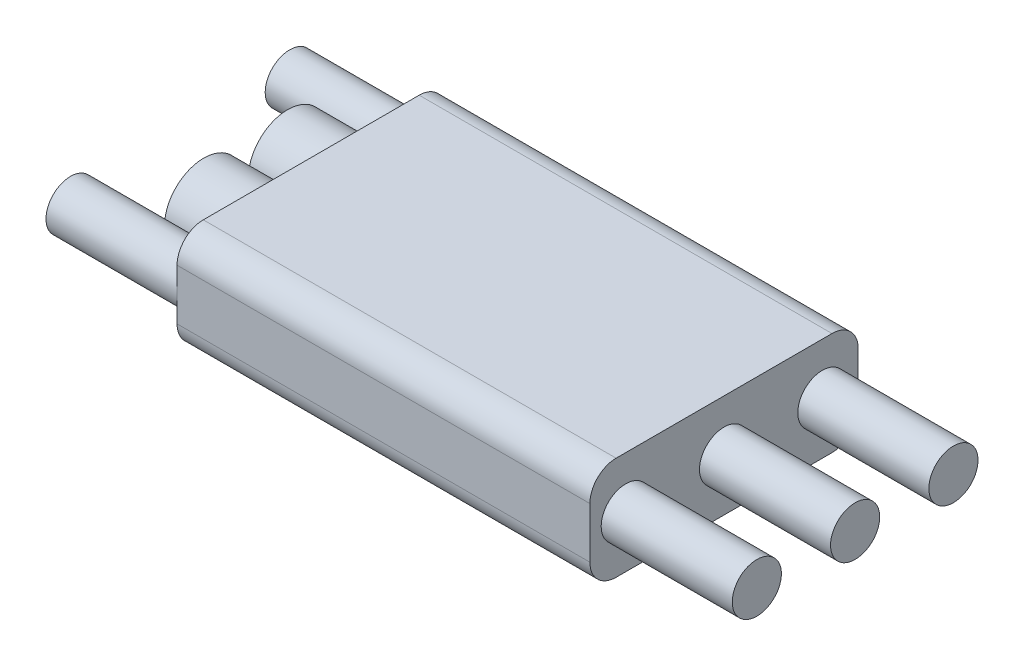
ISO-10303-21;
HEADER;
FILE_DESCRIPTION(('STEP AP214'),'2;1');
FILE_NAME('part.step','',(''),(''),'','','');
FILE_SCHEMA(('AUTOMOTIVE_DESIGN { 1 0 10303 214 1 1 1 1 }'));
ENDSEC;
DATA;
#1=APPLICATION_CONTEXT('core data for automotive mechanical design processes');
#2=APPLICATION_PROTOCOL_DEFINITION('international standard','automotive_design',2000,#1);
#3=PRODUCT_CONTEXT('',#1,'mechanical');
#4=PRODUCT('Part','Part','',(#3));
#5=PRODUCT_RELATED_PRODUCT_CATEGORY('part','',(#4));
#6=PRODUCT_DEFINITION_FORMATION('','',#4);
#7=PRODUCT_DEFINITION_CONTEXT('part definition',#1,'design');
#8=PRODUCT_DEFINITION('design','',#6,#7);
#9=PRODUCT_DEFINITION_SHAPE('','',#8);
#10=(LENGTH_UNIT() NAMED_UNIT(*) SI_UNIT(.MILLI.,.METRE.));
#11=(NAMED_UNIT(*) PLANE_ANGLE_UNIT() SI_UNIT($,.RADIAN.));
#12=(NAMED_UNIT(*) SI_UNIT($,.STERADIAN.) SOLID_ANGLE_UNIT());
#13=UNCERTAINTY_MEASURE_WITH_UNIT(LENGTH_MEASURE(1.E-05),#10,'distance_accuracy_value','');
#14=(GEOMETRIC_REPRESENTATION_CONTEXT(3) GLOBAL_UNCERTAINTY_ASSIGNED_CONTEXT((#13)) GLOBAL_UNIT_ASSIGNED_CONTEXT((#10,
#11,#12)) REPRESENTATION_CONTEXT('',''));
#15=CARTESIAN_POINT('',(0.,0.,0.));
#16=DIRECTION('',(0.,0.,1.));
#17=DIRECTION('',(1.,0.,0.));
#18=AXIS2_PLACEMENT_3D('',#15,#16,#17);
#19=CARTESIAN_POINT('',(20.,5.,13.));
#20=DIRECTION('',(-1.,0.,0.));
#21=DIRECTION('',(0.,0.,1.));
#22=AXIS2_PLACEMENT_3D('',#19,#20,#21);
#23=PLANE('',#22);
#24=CARTESIAN_POINT('',(20.,0.,-9.525));
#25=DIRECTION('',(-1.,0.,0.));
#26=DIRECTION('',(0.,0.,1.));
#27=AXIS2_PLACEMENT_3D('',#24,#25,#26);
#28=CIRCLE('',#27,2.38125);
#29=CARTESIAN_POINT('',(20.,0.,-7.14375));
#30=VERTEX_POINT('',#29);
#31=EDGE_CURVE('E141',#30,#30,#28,.F.);
#32=ORIENTED_EDGE('',*,*,#31,.F.);
#33=EDGE_LOOP('',(#32));
#34=FACE_BOUND('',#33,.T.);
#35=CARTESIAN_POINT('',(20.,0.,9.525));
#36=DIRECTION('',(-1.,0.,0.));
#37=DIRECTION('',(0.,0.,1.));
#38=AXIS2_PLACEMENT_3D('',#35,#36,#37);
#39=CIRCLE('',#38,2.38125);
#40=CARTESIAN_POINT('',(20.,0.,11.90625));
#41=VERTEX_POINT('',#40);
#42=EDGE_CURVE('E138',#41,#41,#39,.F.);
#43=ORIENTED_EDGE('',*,*,#42,.F.);
#44=EDGE_LOOP('',(#43));
#45=FACE_BOUND('',#44,.T.);
#46=CARTESIAN_POINT('',(20.,0.,0.));
#47=DIRECTION('',(-1.,0.,0.));
#48=DIRECTION('',(0.,0.,1.));
#49=AXIS2_PLACEMENT_3D('',#46,#47,#48);
#50=CIRCLE('',#49,2.38125);
#51=CARTESIAN_POINT('',(20.,0.,2.38125));
#52=VERTEX_POINT('',#51);
#53=EDGE_CURVE('E135',#52,#52,#50,.F.);
#54=ORIENTED_EDGE('',*,*,#53,.F.);
#55=EDGE_LOOP('',(#54));
#56=FACE_BOUND('',#55,.T.);
#57=DIRECTION('',(0.,-1.,0.));
#58=VECTOR('',#57,1.);
#59=CARTESIAN_POINT('',(20.,5.,13.));
#60=LINE('',#59,#58);
#61=CARTESIAN_POINT('',(20.,2.46,13.));
#62=VERTEX_POINT('',#61);
#63=CARTESIAN_POINT('',(20.,-2.46,13.));
#64=VERTEX_POINT('',#63);
#65=EDGE_CURVE('E124',#62,#64,#60,.T.);
#66=ORIENTED_EDGE('',*,*,#65,.T.);
#67=CARTESIAN_POINT('',(20.,-2.46,10.46));
#68=DIRECTION('',(-1.,0.,0.));
#69=DIRECTION('',(0.,0.,1.));
#70=AXIS2_PLACEMENT_3D('',#67,#68,#69);
#71=CIRCLE('',#70,2.54);
#72=CARTESIAN_POINT('',(20.,-5.,10.46));
#73=VERTEX_POINT('',#72);
#74=EDGE_CURVE('E159',#64,#73,#71,.F.);
#75=ORIENTED_EDGE('',*,*,#74,.T.);
#76=DIRECTION('',(0.,0.,-1.));
#77=VECTOR('',#76,1.);
#78=CARTESIAN_POINT('',(20.,-5.,13.));
#79=LINE('',#78,#77);
#80=CARTESIAN_POINT('',(20.,-5.,-10.46));
#81=VERTEX_POINT('',#80);
#82=EDGE_CURVE('E189',#73,#81,#79,.T.);
#83=ORIENTED_EDGE('',*,*,#82,.T.);
#84=CARTESIAN_POINT('',(20.,-2.46,-10.46));
#85=DIRECTION('',(-1.,0.,0.));
#86=DIRECTION('',(0.,0.,1.));
#87=AXIS2_PLACEMENT_3D('',#84,#85,#86);
#88=CIRCLE('',#87,2.54);
#89=CARTESIAN_POINT('',(20.,-2.46,-13.));
#90=VERTEX_POINT('',#89);
#91=EDGE_CURVE('E157',#81,#90,#88,.F.);
#92=ORIENTED_EDGE('',*,*,#91,.T.);
#93=DIRECTION('',(0.,-1.,0.));
#94=VECTOR('',#93,1.);
#95=CARTESIAN_POINT('',(20.,5.,-13.));
#96=LINE('',#95,#94);
#97=CARTESIAN_POINT('',(20.,2.46,-13.));
#98=VERTEX_POINT('',#97);
#99=EDGE_CURVE('E132',#98,#90,#96,.T.);
#100=ORIENTED_EDGE('',*,*,#99,.F.);
#101=CARTESIAN_POINT('',(20.,2.46,-10.46));
#102=DIRECTION('',(-1.,0.,0.));
#103=DIRECTION('',(0.,0.,1.));
#104=AXIS2_PLACEMENT_3D('',#101,#102,#103);
#105=CIRCLE('',#104,2.54);
#106=CARTESIAN_POINT('',(20.,5.,-10.46));
#107=VERTEX_POINT('',#106);
#108=EDGE_CURVE('E155',#98,#107,#105,.F.);
#109=ORIENTED_EDGE('',*,*,#108,.T.);
#110=DIRECTION('',(0.,0.,-1.));
#111=VECTOR('',#110,1.);
#112=CARTESIAN_POINT('',(20.,5.,13.));
#113=LINE('',#112,#111);
#114=CARTESIAN_POINT('',(20.,5.,10.46));
#115=VERTEX_POINT('',#114);
#116=EDGE_CURVE('E180',#115,#107,#113,.T.);
#117=ORIENTED_EDGE('',*,*,#116,.F.);
#118=CARTESIAN_POINT('',(20.,2.46,10.46));
#119=DIRECTION('',(-1.,0.,0.));
#120=DIRECTION('',(0.,0.,1.));
#121=AXIS2_PLACEMENT_3D('',#118,#119,#120);
#122=CIRCLE('',#121,2.54);
#123=EDGE_CURVE('E153',#115,#62,#122,.F.);
#124=ORIENTED_EDGE('',*,*,#123,.T.);
#125=EDGE_LOOP('',(#66,#75,#83,#92,#100,#109,#117,#124));
#126=FACE_BOUND('',#125,.T.);
#127=ADVANCED_FACE('F33',(#34,#45,#56,#126),#23,.F.);
#128=CARTESIAN_POINT('',(-20.,5.,-13.));
#129=DIRECTION('',(0.,0.,1.));
#130=DIRECTION('',(1.,0.,0.));
#131=AXIS2_PLACEMENT_3D('',#128,#129,#130);
#132=PLANE('',#131);
#133=ORIENTED_EDGE('',*,*,#99,.T.);
#134=DIRECTION('',(-1.,0.,0.));
#135=VECTOR('',#134,1.);
#136=CARTESIAN_POINT('',(-20.,-2.46,-13.));
#137=LINE('',#136,#135);
#138=CARTESIAN_POINT('',(-20.,-2.46,-13.));
#139=VERTEX_POINT('',#138);
#140=EDGE_CURVE('E172',#90,#139,#137,.T.);
#141=ORIENTED_EDGE('',*,*,#140,.T.);
#142=DIRECTION('',(0.,-1.,0.));
#143=VECTOR('',#142,1.);
#144=CARTESIAN_POINT('',(-20.,5.,-13.));
#145=LINE('',#144,#143);
#146=CARTESIAN_POINT('',(-20.,0.,-13.));
#147=VERTEX_POINT('',#146);
#148=EDGE_CURVE('E116',#147,#139,#145,.T.);
#149=ORIENTED_EDGE('',*,*,#148,.F.);
#150=CARTESIAN_POINT('',(-20.,2.46,-13.));
#151=VERTEX_POINT('',#150);
#152=EDGE_CURVE('E130',#151,#147,#145,.T.);
#153=ORIENTED_EDGE('',*,*,#152,.F.);
#154=DIRECTION('',(-1.,0.,0.));
#155=VECTOR('',#154,1.);
#156=CARTESIAN_POINT('',(-20.,2.46,-13.));
#157=LINE('',#156,#155);
#158=EDGE_CURVE('E170',#151,#98,#157,.F.);
#159=ORIENTED_EDGE('',*,*,#158,.T.);
#160=EDGE_LOOP('',(#133,#141,#149,#153,#159));
#161=FACE_BOUND('',#160,.T.);
#162=ADVANCED_FACE('F242',(#161),#132,.F.);
#163=CARTESIAN_POINT('',(-20.,5.,13.));
#164=DIRECTION('',(1.,0.,0.));
#165=DIRECTION('',(0.,0.,-1.));
#166=AXIS2_PLACEMENT_3D('',#163,#164,#165);
#167=PLANE('',#166);
#168=CARTESIAN_POINT('',(-20.,0.,4.064));
#169=DIRECTION('',(1.,0.,0.));
#170=DIRECTION('',(0.,0.,-1.));
#171=AXIS2_PLACEMENT_3D('',#168,#169,#170);
#172=CIRCLE('',#171,3.81);
#173=CARTESIAN_POINT('',(-20.,0.,0.254000000000001));
#174=VERTEX_POINT('',#173);
#175=EDGE_CURVE('E147',#174,#174,#172,.F.);
#176=ORIENTED_EDGE('',*,*,#175,.F.);
#177=EDGE_LOOP('',(#176));
#178=FACE_BOUND('',#177,.T.);
#179=CARTESIAN_POINT('',(-20.,0.,-4.064));
#180=DIRECTION('',(1.,0.,0.));
#181=DIRECTION('',(0.,0.,-1.));
#182=AXIS2_PLACEMENT_3D('',#179,#180,#181);
#183=CIRCLE('',#182,3.81);
#184=CARTESIAN_POINT('',(-20.,0.,-7.874));
#185=VERTEX_POINT('',#184);
#186=EDGE_CURVE('E144',#185,#185,#183,.F.);
#187=ORIENTED_EDGE('',*,*,#186,.F.);
#188=EDGE_LOOP('',(#187));
#189=FACE_BOUND('',#188,.T.);
#190=DIRECTION('',(0.,0.,1.));
#191=VECTOR('',#190,1.);
#192=CARTESIAN_POINT('',(-20.,-5.,13.));
#193=LINE('',#192,#191);
#194=CARTESIAN_POINT('',(-20.,-5.,-10.46));
#195=VERTEX_POINT('',#194);
#196=CARTESIAN_POINT('',(-20.,-5.,10.46));
#197=VERTEX_POINT('',#196);
#198=EDGE_CURVE('E186',#195,#197,#193,.T.);
#199=ORIENTED_EDGE('',*,*,#198,.T.);
#200=CARTESIAN_POINT('',(-20.,-2.46,10.46));
#201=DIRECTION('',(1.,0.,0.));
#202=DIRECTION('',(0.,0.,-1.));
#203=AXIS2_PLACEMENT_3D('',#200,#201,#202);
#204=CIRCLE('',#203,2.54);
#205=CARTESIAN_POINT('',(-20.,-2.46,13.));
#206=VERTEX_POINT('',#205);
#207=EDGE_CURVE('E123',#197,#206,#204,.F.);
#208=ORIENTED_EDGE('',*,*,#207,.T.);
#209=DIRECTION('',(0.,-1.,0.));
#210=VECTOR('',#209,1.);
#211=CARTESIAN_POINT('',(-20.,5.,13.));
#212=LINE('',#211,#210);
#213=CARTESIAN_POINT('',(-20.,0.,13.));
#214=VERTEX_POINT('',#213);
#215=EDGE_CURVE('E109',#214,#206,#212,.T.);
#216=ORIENTED_EDGE('',*,*,#215,.F.);
#217=CARTESIAN_POINT('',(-20.,0.,10.61875));
#218=DIRECTION('',(-1.,0.,0.));
#219=DIRECTION('',(0.,0.,1.));
#220=AXIS2_PLACEMENT_3D('',#217,#218,#219);
#221=CIRCLE('',#220,2.38125);
#222=EDGE_CURVE('E121',#214,#214,#221,.T.);
#223=ORIENTED_EDGE('',*,*,#222,.F.);
#224=CARTESIAN_POINT('',(-20.,2.46,13.));
#225=VERTEX_POINT('',#224);
#226=EDGE_CURVE('E105',#225,#214,#212,.T.);
#227=ORIENTED_EDGE('',*,*,#226,.F.);
#228=CARTESIAN_POINT('',(-20.,2.46,10.46));
#229=DIRECTION('',(1.,0.,0.));
#230=DIRECTION('',(0.,0.,-1.));
#231=AXIS2_PLACEMENT_3D('',#228,#229,#230);
#232=CIRCLE('',#231,2.54);
#233=CARTESIAN_POINT('',(-20.,5.,10.46));
#234=VERTEX_POINT('',#233);
#235=EDGE_CURVE('E165',#225,#234,#232,.F.);
#236=ORIENTED_EDGE('',*,*,#235,.T.);
#237=DIRECTION('',(0.,0.,1.));
#238=VECTOR('',#237,1.);
#239=CARTESIAN_POINT('',(-20.,5.,13.));
#240=LINE('',#239,#238);
#241=CARTESIAN_POINT('',(-20.,5.,-10.46));
#242=VERTEX_POINT('',#241);
#243=EDGE_CURVE('E126',#242,#234,#240,.T.);
#244=ORIENTED_EDGE('',*,*,#243,.F.);
#245=CARTESIAN_POINT('',(-20.,2.46,-10.46));
#246=DIRECTION('',(1.,0.,0.));
#247=DIRECTION('',(0.,0.,-1.));
#248=AXIS2_PLACEMENT_3D('',#245,#246,#247);
#249=CIRCLE('',#248,2.54);
#250=EDGE_CURVE('E56',#242,#151,#249,.F.);
#251=ORIENTED_EDGE('',*,*,#250,.T.);
#252=ORIENTED_EDGE('',*,*,#152,.T.);
#253=CARTESIAN_POINT('',(-20.,0.,-10.61875));
#254=DIRECTION('',(-1.,0.,0.));
#255=DIRECTION('',(0.,0.,1.));
#256=AXIS2_PLACEMENT_3D('',#253,#254,#255);
#257=CIRCLE('',#256,2.38125);
#258=EDGE_CURVE('E215',#147,#147,#257,.T.);
#259=ORIENTED_EDGE('',*,*,#258,.F.);
#260=ORIENTED_EDGE('',*,*,#148,.T.);
#261=CARTESIAN_POINT('',(-20.,-2.46,-10.46));
#262=DIRECTION('',(1.,0.,0.));
#263=DIRECTION('',(0.,0.,-1.));
#264=AXIS2_PLACEMENT_3D('',#261,#262,#263);
#265=CIRCLE('',#264,2.54);
#266=EDGE_CURVE('E48',#139,#195,#265,.F.);
#267=ORIENTED_EDGE('',*,*,#266,.T.);
#268=EDGE_LOOP('',(#199,#208,#216,#223,#227,#236,#244,#251,#252,#259,#260,#267));
#269=FACE_BOUND('',#268,.T.);
#270=ADVANCED_FACE('F119',(#178,#189,#269),#167,.F.);
#271=CARTESIAN_POINT('',(-20.,5.,13.));
#272=DIRECTION('',(0.,0.,-1.));
#273=DIRECTION('',(-1.,0.,0.));
#274=AXIS2_PLACEMENT_3D('',#271,#272,#273);
#275=PLANE('',#274);
#276=ORIENTED_EDGE('',*,*,#215,.T.);
#277=DIRECTION('',(1.,0.,0.));
#278=VECTOR('',#277,1.);
#279=CARTESIAN_POINT('',(20.,-2.46,13.));
#280=LINE('',#279,#278);
#281=EDGE_CURVE('E151',#206,#64,#280,.T.);
#282=ORIENTED_EDGE('',*,*,#281,.T.);
#283=ORIENTED_EDGE('',*,*,#65,.F.);
#284=DIRECTION('',(1.,0.,0.));
#285=VECTOR('',#284,1.);
#286=CARTESIAN_POINT('',(-20.,2.46,13.));
#287=LINE('',#286,#285);
#288=EDGE_CURVE('E113',#62,#225,#287,.F.);
#289=ORIENTED_EDGE('',*,*,#288,.T.);
#290=ORIENTED_EDGE('',*,*,#226,.T.);
#291=EDGE_LOOP('',(#276,#282,#283,#289,#290));
#292=FACE_BOUND('',#291,.T.);
#293=ADVANCED_FACE('F107',(#292),#275,.F.);
#294=CARTESIAN_POINT('',(0.,5.,0.));
#295=DIRECTION('',(0.,-1.,0.));
#296=DIRECTION('',(0.,0.,-1.));
#297=AXIS2_PLACEMENT_3D('',#294,#295,#296);
#298=PLANE('',#297);
#299=ORIENTED_EDGE('',*,*,#116,.T.);
#300=DIRECTION('',(-1.,0.,0.));
#301=VECTOR('',#300,1.);
#302=CARTESIAN_POINT('',(0.,5.,-10.46));
#303=LINE('',#302,#301);
#304=EDGE_CURVE('E11',#107,#242,#303,.T.);
#305=ORIENTED_EDGE('',*,*,#304,.T.);
#306=ORIENTED_EDGE('',*,*,#243,.T.);
#307=DIRECTION('',(1.,0.,0.));
#308=VECTOR('',#307,1.);
#309=CARTESIAN_POINT('',(0.,5.,10.46));
#310=LINE('',#309,#308);
#311=EDGE_CURVE('E41',#234,#115,#310,.T.);
#312=ORIENTED_EDGE('',*,*,#311,.T.);
#313=EDGE_LOOP('',(#299,#305,#306,#312));
#314=FACE_BOUND('',#313,.T.);
#315=ADVANCED_FACE('F179',(#314),#298,.F.);
#316=CARTESIAN_POINT('',(0.,-5.,0.));
#317=DIRECTION('',(0.,-1.,0.));
#318=DIRECTION('',(0.,0.,-1.));
#319=AXIS2_PLACEMENT_3D('',#316,#317,#318);
#320=PLANE('',#319);
#321=ORIENTED_EDGE('',*,*,#82,.F.);
#322=DIRECTION('',(1.,0.,0.));
#323=VECTOR('',#322,1.);
#324=CARTESIAN_POINT('',(-20.,-5.,10.46));
#325=LINE('',#324,#323);
#326=EDGE_CURVE('E163',#73,#197,#325,.F.);
#327=ORIENTED_EDGE('',*,*,#326,.T.);
#328=ORIENTED_EDGE('',*,*,#198,.F.);
#329=DIRECTION('',(-1.,0.,0.));
#330=VECTOR('',#329,1.);
#331=CARTESIAN_POINT('',(20.,-5.,-10.46));
#332=LINE('',#331,#330);
#333=EDGE_CURVE('E161',#195,#81,#332,.F.);
#334=ORIENTED_EDGE('',*,*,#333,.T.);
#335=EDGE_LOOP('',(#321,#327,#328,#334));
#336=FACE_BOUND('',#335,.T.);
#337=ADVANCED_FACE('F315',(#336),#320,.T.);
#338=CARTESIAN_POINT('',(32.7,0.,0.));
#339=DIRECTION('',(-1.,0.,0.));
#340=DIRECTION('',(0.,0.,1.));
#341=AXIS2_PLACEMENT_3D('',#338,#339,#340);
#342=CYLINDRICAL_SURFACE('',#341,2.38125);
#343=CARTESIAN_POINT('',(32.7,0.,0.));
#344=DIRECTION('',(1.,0.,0.));
#345=DIRECTION('',(0.,0.,-1.));
#346=AXIS2_PLACEMENT_3D('',#343,#344,#345);
#347=CIRCLE('',#346,2.38125);
#348=CARTESIAN_POINT('',(32.7,0.,-2.38125));
#349=VERTEX_POINT('',#348);
#350=EDGE_CURVE('E191',#349,#349,#347,.T.);
#351=ORIENTED_EDGE('',*,*,#350,.F.);
#352=EDGE_LOOP('',(#351));
#353=FACE_BOUND('',#352,.T.);
#354=ORIENTED_EDGE('',*,*,#53,.T.);
#355=EDGE_LOOP('',(#354));
#356=FACE_BOUND('',#355,.T.);
#357=ADVANCED_FACE('F312',(#353,#356),#342,.T.);
#358=CARTESIAN_POINT('',(32.7,0.,0.));
#359=DIRECTION('',(1.,0.,0.));
#360=DIRECTION('',(0.,0.,-1.));
#361=AXIS2_PLACEMENT_3D('',#358,#359,#360);
#362=PLANE('',#361);
#363=ORIENTED_EDGE('',*,*,#350,.T.);
#364=EDGE_LOOP('',(#363));
#365=FACE_BOUND('',#364,.T.);
#366=ADVANCED_FACE('F308',(#365),#362,.T.);
#367=CARTESIAN_POINT('',(32.7,0.,9.525));
#368=DIRECTION('',(-1.,0.,0.));
#369=DIRECTION('',(0.,0.,1.));
#370=AXIS2_PLACEMENT_3D('',#367,#368,#369);
#371=CYLINDRICAL_SURFACE('',#370,2.38125);
#372=CARTESIAN_POINT('',(32.7,0.,9.525));
#373=DIRECTION('',(1.,0.,0.));
#374=DIRECTION('',(0.,0.,-1.));
#375=AXIS2_PLACEMENT_3D('',#372,#373,#374);
#376=CIRCLE('',#375,2.38125);
#377=CARTESIAN_POINT('',(32.7,0.,7.14375));
#378=VERTEX_POINT('',#377);
#379=EDGE_CURVE('E198',#378,#378,#376,.T.);
#380=ORIENTED_EDGE('',*,*,#379,.F.);
#381=EDGE_LOOP('',(#380));
#382=FACE_BOUND('',#381,.T.);
#383=ORIENTED_EDGE('',*,*,#42,.T.);
#384=EDGE_LOOP('',(#383));
#385=FACE_BOUND('',#384,.T.);
#386=ADVANCED_FACE('F305',(#382,#385),#371,.T.);
#387=CARTESIAN_POINT('',(32.7,0.,9.525));
#388=DIRECTION('',(1.,0.,0.));
#389=DIRECTION('',(0.,0.,-1.));
#390=AXIS2_PLACEMENT_3D('',#387,#388,#389);
#391=PLANE('',#390);
#392=ORIENTED_EDGE('',*,*,#379,.T.);
#393=EDGE_LOOP('',(#392));
#394=FACE_BOUND('',#393,.T.);
#395=ADVANCED_FACE('F301',(#394),#391,.T.);
#396=CARTESIAN_POINT('',(32.7,0.,-9.525));
#397=DIRECTION('',(-1.,0.,0.));
#398=DIRECTION('',(0.,0.,1.));
#399=AXIS2_PLACEMENT_3D('',#396,#397,#398);
#400=CYLINDRICAL_SURFACE('',#399,2.38125);
#401=CARTESIAN_POINT('',(32.7,0.,-9.525));
#402=DIRECTION('',(1.,0.,0.));
#403=DIRECTION('',(0.,0.,-1.));
#404=AXIS2_PLACEMENT_3D('',#401,#402,#403);
#405=CIRCLE('',#404,2.38125);
#406=CARTESIAN_POINT('',(32.7,0.,-11.90625));
#407=VERTEX_POINT('',#406);
#408=EDGE_CURVE('E202',#407,#407,#405,.T.);
#409=ORIENTED_EDGE('',*,*,#408,.F.);
#410=EDGE_LOOP('',(#409));
#411=FACE_BOUND('',#410,.T.);
#412=ORIENTED_EDGE('',*,*,#31,.T.);
#413=EDGE_LOOP('',(#412));
#414=FACE_BOUND('',#413,.T.);
#415=ADVANCED_FACE('F297',(#411,#414),#400,.T.);
#416=CARTESIAN_POINT('',(32.7,0.,-9.525));
#417=DIRECTION('',(1.,0.,0.));
#418=DIRECTION('',(0.,0.,-1.));
#419=AXIS2_PLACEMENT_3D('',#416,#417,#418);
#420=PLANE('',#419);
#421=ORIENTED_EDGE('',*,*,#408,.T.);
#422=EDGE_LOOP('',(#421));
#423=FACE_BOUND('',#422,.T.);
#424=ADVANCED_FACE('F293',(#423),#420,.T.);
#425=CARTESIAN_POINT('',(-26.35,0.,-4.064));
#426=DIRECTION('',(1.,0.,0.));
#427=DIRECTION('',(0.,0.,-1.));
#428=AXIS2_PLACEMENT_3D('',#425,#426,#427);
#429=CYLINDRICAL_SURFACE('',#428,3.81);
#430=CARTESIAN_POINT('',(-26.35,0.,-4.064));
#431=DIRECTION('',(-1.,0.,0.));
#432=DIRECTION('',(0.,0.,1.));
#433=AXIS2_PLACEMENT_3D('',#430,#431,#432);
#434=CIRCLE('',#433,3.81);
#435=CARTESIAN_POINT('',(-26.35,0.,-0.254));
#436=VERTEX_POINT('',#435);
#437=EDGE_CURVE('E206',#436,#436,#434,.T.);
#438=ORIENTED_EDGE('',*,*,#437,.F.);
#439=EDGE_LOOP('',(#438));
#440=FACE_BOUND('',#439,.T.);
#441=ORIENTED_EDGE('',*,*,#186,.T.);
#442=EDGE_LOOP('',(#441));
#443=FACE_BOUND('',#442,.T.);
#444=ADVANCED_FACE('F289',(#440,#443),#429,.T.);
#445=CARTESIAN_POINT('',(-26.35,0.,-4.064));
#446=DIRECTION('',(-1.,0.,0.));
#447=DIRECTION('',(0.,0.,1.));
#448=AXIS2_PLACEMENT_3D('',#445,#446,#447);
#449=PLANE('',#448);
#450=ORIENTED_EDGE('',*,*,#437,.T.);
#451=EDGE_LOOP('',(#450));
#452=FACE_BOUND('',#451,.T.);
#453=ADVANCED_FACE('F285',(#452),#449,.T.);
#454=CARTESIAN_POINT('',(-26.35,0.,4.064));
#455=DIRECTION('',(1.,0.,0.));
#456=DIRECTION('',(0.,0.,-1.));
#457=AXIS2_PLACEMENT_3D('',#454,#455,#456);
#458=CYLINDRICAL_SURFACE('',#457,3.81);
#459=CARTESIAN_POINT('',(-26.35,0.,4.064));
#460=DIRECTION('',(-1.,0.,0.));
#461=DIRECTION('',(0.,0.,1.));
#462=AXIS2_PLACEMENT_3D('',#459,#460,#461);
#463=CIRCLE('',#462,3.81);
#464=CARTESIAN_POINT('',(-26.35,0.,7.874));
#465=VERTEX_POINT('',#464);
#466=EDGE_CURVE('E211',#465,#465,#463,.T.);
#467=ORIENTED_EDGE('',*,*,#466,.F.);
#468=EDGE_LOOP('',(#467));
#469=FACE_BOUND('',#468,.T.);
#470=ORIENTED_EDGE('',*,*,#175,.T.);
#471=EDGE_LOOP('',(#470));
#472=FACE_BOUND('',#471,.T.);
#473=ADVANCED_FACE('F278',(#469,#472),#458,.T.);
#474=CARTESIAN_POINT('',(-26.35,0.,4.064));
#475=DIRECTION('',(-1.,0.,0.));
#476=DIRECTION('',(0.,0.,1.));
#477=AXIS2_PLACEMENT_3D('',#474,#475,#476);
#478=PLANE('',#477);
#479=ORIENTED_EDGE('',*,*,#466,.T.);
#480=EDGE_LOOP('',(#479));
#481=FACE_BOUND('',#480,.T.);
#482=ADVANCED_FACE('F272',(#481),#478,.T.);
#483=CARTESIAN_POINT('',(-32.7,0.,-10.61875));
#484=DIRECTION('',(1.,0.,0.));
#485=DIRECTION('',(0.,0.,-1.));
#486=AXIS2_PLACEMENT_3D('',#483,#484,#485);
#487=CYLINDRICAL_SURFACE('',#486,2.38125);
#488=CARTESIAN_POINT('',(-32.7,0.,-10.61875));
#489=DIRECTION('',(-1.,0.,0.));
#490=DIRECTION('',(0.,0.,1.));
#491=AXIS2_PLACEMENT_3D('',#488,#489,#490);
#492=CIRCLE('',#491,2.38125);
#493=CARTESIAN_POINT('',(-32.7,0.,-8.2375));
#494=VERTEX_POINT('',#493);
#495=EDGE_CURVE('E214',#494,#494,#492,.T.);
#496=ORIENTED_EDGE('',*,*,#495,.F.);
#497=EDGE_LOOP('',(#496));
#498=FACE_BOUND('',#497,.T.);
#499=ORIENTED_EDGE('',*,*,#258,.T.);
#500=EDGE_LOOP('',(#499));
#501=FACE_BOUND('',#500,.T.);
#502=ADVANCED_FACE('F238',(#498,#501),#487,.T.);
#503=CARTESIAN_POINT('',(-32.7,0.,-10.61875));
#504=DIRECTION('',(-1.,0.,0.));
#505=DIRECTION('',(0.,0.,1.));
#506=AXIS2_PLACEMENT_3D('',#503,#504,#505);
#507=PLANE('',#506);
#508=ORIENTED_EDGE('',*,*,#495,.T.);
#509=EDGE_LOOP('',(#508));
#510=FACE_BOUND('',#509,.T.);
#511=ADVANCED_FACE('F230',(#510),#507,.T.);
#512=CARTESIAN_POINT('',(-32.7,0.,10.61875));
#513=DIRECTION('',(1.,0.,0.));
#514=DIRECTION('',(0.,0.,-1.));
#515=AXIS2_PLACEMENT_3D('',#512,#513,#514);
#516=CYLINDRICAL_SURFACE('',#515,2.38125);
#517=CARTESIAN_POINT('',(-32.7,0.,10.61875));
#518=DIRECTION('',(-1.,0.,0.));
#519=DIRECTION('',(0.,0.,1.));
#520=AXIS2_PLACEMENT_3D('',#517,#518,#519);
#521=CIRCLE('',#520,2.38125);
#522=CARTESIAN_POINT('',(-32.7,0.,13.));
#523=VERTEX_POINT('',#522);
#524=EDGE_CURVE('E218',#523,#523,#521,.T.);
#525=ORIENTED_EDGE('',*,*,#524,.F.);
#526=EDGE_LOOP('',(#525));
#527=FACE_BOUND('',#526,.T.);
#528=ORIENTED_EDGE('',*,*,#222,.T.);
#529=EDGE_LOOP('',(#528));
#530=FACE_BOUND('',#529,.T.);
#531=ADVANCED_FACE('F227',(#527,#530),#516,.T.);
#532=CARTESIAN_POINT('',(-32.7,0.,10.61875));
#533=DIRECTION('',(-1.,0.,0.));
#534=DIRECTION('',(0.,0.,1.));
#535=AXIS2_PLACEMENT_3D('',#532,#533,#534);
#536=PLANE('',#535);
#537=ORIENTED_EDGE('',*,*,#524,.T.);
#538=EDGE_LOOP('',(#537));
#539=FACE_BOUND('',#538,.T.);
#540=ADVANCED_FACE('F225',(#539),#536,.T.);
#541=CARTESIAN_POINT('',(-20.,-2.46,10.46));
#542=DIRECTION('',(-1.,0.,0.));
#543=DIRECTION('',(0.,0.,1.));
#544=AXIS2_PLACEMENT_3D('',#541,#542,#543);
#545=CYLINDRICAL_SURFACE('',#544,2.54);
#546=ORIENTED_EDGE('',*,*,#207,.F.);
#547=ORIENTED_EDGE('',*,*,#326,.F.);
#548=ORIENTED_EDGE('',*,*,#74,.F.);
#549=ORIENTED_EDGE('',*,*,#281,.F.);
#550=EDGE_LOOP('',(#546,#547,#548,#549));
#551=FACE_BOUND('',#550,.T.);
#552=ADVANCED_FACE('F236',(#551),#545,.T.);
#553=CARTESIAN_POINT('',(-20.,-2.46,-10.46));
#554=DIRECTION('',(1.,0.,0.));
#555=DIRECTION('',(0.,0.,-1.));
#556=AXIS2_PLACEMENT_3D('',#553,#554,#555);
#557=CYLINDRICAL_SURFACE('',#556,2.54);
#558=ORIENTED_EDGE('',*,*,#91,.F.);
#559=ORIENTED_EDGE('',*,*,#333,.F.);
#560=ORIENTED_EDGE('',*,*,#266,.F.);
#561=ORIENTED_EDGE('',*,*,#140,.F.);
#562=EDGE_LOOP('',(#558,#559,#560,#561));
#563=FACE_BOUND('',#562,.T.);
#564=ADVANCED_FACE('F256',(#563),#557,.T.);
#565=CARTESIAN_POINT('',(0.,2.46,-10.46));
#566=DIRECTION('',(-1.,0.,0.));
#567=DIRECTION('',(0.,0.,1.));
#568=AXIS2_PLACEMENT_3D('',#565,#566,#567);
#569=CYLINDRICAL_SURFACE('',#568,2.54);
#570=ORIENTED_EDGE('',*,*,#108,.F.);
#571=ORIENTED_EDGE('',*,*,#158,.F.);
#572=ORIENTED_EDGE('',*,*,#250,.F.);
#573=ORIENTED_EDGE('',*,*,#304,.F.);
#574=EDGE_LOOP('',(#570,#571,#572,#573));
#575=FACE_BOUND('',#574,.T.);
#576=ADVANCED_FACE('F259',(#575),#569,.T.);
#577=CARTESIAN_POINT('',(0.,2.46,10.46));
#578=DIRECTION('',(1.,0.,0.));
#579=DIRECTION('',(0.,0.,-1.));
#580=AXIS2_PLACEMENT_3D('',#577,#578,#579);
#581=CYLINDRICAL_SURFACE('',#580,2.54);
#582=ORIENTED_EDGE('',*,*,#235,.F.);
#583=ORIENTED_EDGE('',*,*,#288,.F.);
#584=ORIENTED_EDGE('',*,*,#123,.F.);
#585=ORIENTED_EDGE('',*,*,#311,.F.);
#586=EDGE_LOOP('',(#582,#583,#584,#585));
#587=FACE_BOUND('',#586,.T.);
#588=ADVANCED_FACE('F35',(#587),#581,.T.);
#589=CLOSED_SHELL('',(#127,#162,#270,#293,#315,#337,#357,#366,#386,#395,#415,#424,#444,#453,
#473,#482,#502,#511,#531,#540,#552,#564,#576,#588));
#590=MANIFOLD_SOLID_BREP('B2',#589);
#591=ADVANCED_BREP_SHAPE_REPRESENTATION('',(#18,#590),#14);
#592=SHAPE_DEFINITION_REPRESENTATION(#9,#591);
ENDSEC;
END-ISO-10303-21;
